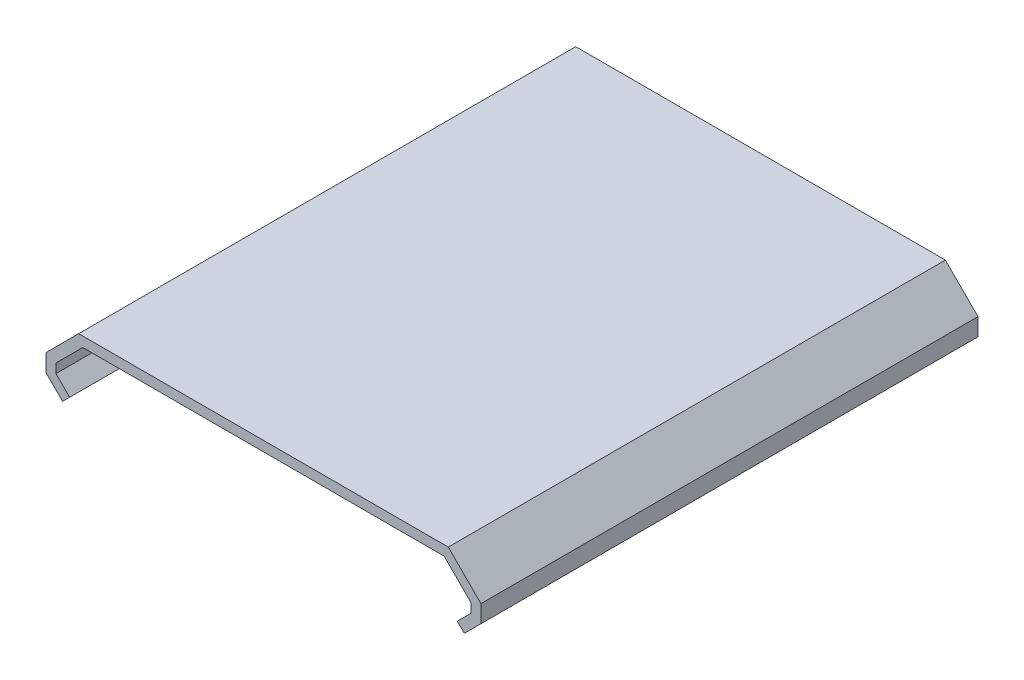
ISO-10303-21;
HEADER;
FILE_DESCRIPTION(('STEP AP214'),'2;1');
FILE_NAME('part.step','',(''),(''),'','','');
FILE_SCHEMA(('AUTOMOTIVE_DESIGN { 1 0 10303 214 1 1 1 1 }'));
ENDSEC;
DATA;
#1=APPLICATION_CONTEXT('core data for automotive mechanical design processes');
#2=APPLICATION_PROTOCOL_DEFINITION('international standard','automotive_design',2000,#1);
#3=PRODUCT_CONTEXT('',#1,'mechanical');
#4=PRODUCT('Part','Part','',(#3));
#5=PRODUCT_RELATED_PRODUCT_CATEGORY('part','',(#4));
#6=PRODUCT_DEFINITION_FORMATION('','',#4);
#7=PRODUCT_DEFINITION_CONTEXT('part definition',#1,'design');
#8=PRODUCT_DEFINITION('design','',#6,#7);
#9=PRODUCT_DEFINITION_SHAPE('','',#8);
#10=(LENGTH_UNIT() NAMED_UNIT(*) SI_UNIT(.MILLI.,.METRE.));
#11=(NAMED_UNIT(*) PLANE_ANGLE_UNIT() SI_UNIT($,.RADIAN.));
#12=(NAMED_UNIT(*) SI_UNIT($,.STERADIAN.) SOLID_ANGLE_UNIT());
#13=UNCERTAINTY_MEASURE_WITH_UNIT(LENGTH_MEASURE(1.E-05),#10,'distance_accuracy_value','');
#14=(GEOMETRIC_REPRESENTATION_CONTEXT(3) GLOBAL_UNCERTAINTY_ASSIGNED_CONTEXT((#13)) GLOBAL_UNIT_ASSIGNED_CONTEXT((#10,
#11,#12)) REPRESENTATION_CONTEXT('',''));
#15=CARTESIAN_POINT('',(0.,0.,0.));
#16=DIRECTION('',(0.,0.,1.));
#17=DIRECTION('',(1.,0.,0.));
#18=AXIS2_PLACEMENT_3D('',#15,#16,#17);
#19=CARTESIAN_POINT('',(83.5,37.5,-200.));
#20=DIRECTION('',(-0.707106781186549,0.707106781186546,0.));
#21=DIRECTION('',(-0.707106781186546,-0.707106781186549,0.));
#22=AXIS2_PLACEMENT_3D('',#19,#20,#21);
#23=PLANE('',#22);
#24=DIRECTION('',(-0.707106781186546,-0.707106781186549,0.));
#25=VECTOR('',#24,1.);
#26=CARTESIAN_POINT('',(83.5,37.5,0.));
#27=LINE('',#26,#25);
#28=CARTESIAN_POINT('',(83.5,37.5,0.));
#29=VERTEX_POINT('',#28);
#30=CARTESIAN_POINT('',(78.,32.,0.));
#31=VERTEX_POINT('',#30);
#32=EDGE_CURVE('E196',#29,#31,#27,.T.);
#33=ORIENTED_EDGE('',*,*,#32,.F.);
#34=DIRECTION('',(0.,0.,1.));
#35=VECTOR('',#34,1.);
#36=CARTESIAN_POINT('',(83.5,37.5,-200.));
#37=LINE('',#36,#35);
#38=CARTESIAN_POINT('',(83.5,37.5,-200.));
#39=VERTEX_POINT('',#38);
#40=EDGE_CURVE('E11',#39,#29,#37,.T.);
#41=ORIENTED_EDGE('',*,*,#40,.F.);
#42=DIRECTION('',(-0.707106781186546,-0.707106781186549,0.));
#43=VECTOR('',#42,1.);
#44=CARTESIAN_POINT('',(83.5,37.5,-200.));
#45=LINE('',#44,#43);
#46=CARTESIAN_POINT('',(78.,32.,-200.));
#47=VERTEX_POINT('',#46);
#48=EDGE_CURVE('E198',#39,#47,#45,.T.);
#49=ORIENTED_EDGE('',*,*,#48,.T.);
#50=DIRECTION('',(0.,0.,1.));
#51=VECTOR('',#50,1.);
#52=CARTESIAN_POINT('',(78.,32.,-200.));
#53=LINE('',#52,#51);
#54=EDGE_CURVE('E44',#47,#31,#53,.T.);
#55=ORIENTED_EDGE('',*,*,#54,.T.);
#56=EDGE_LOOP('',(#33,#41,#49,#55));
#57=FACE_BOUND('',#56,.T.);
#58=ADVANCED_FACE('F41',(#57),#23,.T.);
#59=CARTESIAN_POINT('',(83.5,41.2071067811866,-200.));
#60=DIRECTION('',(-1.,0.,0.));
#61=DIRECTION('',(0.,0.,1.));
#62=AXIS2_PLACEMENT_3D('',#59,#60,#61);
#63=PLANE('',#62);
#64=DIRECTION('',(0.,-1.,0.));
#65=VECTOR('',#64,1.);
#66=CARTESIAN_POINT('',(83.5,41.2071067811866,0.));
#67=LINE('',#66,#65);
#68=CARTESIAN_POINT('',(83.5,41.2071067811866,0.));
#69=VERTEX_POINT('',#68);
#70=EDGE_CURVE('E202',#69,#29,#67,.T.);
#71=ORIENTED_EDGE('',*,*,#70,.F.);
#72=DIRECTION('',(0.,0.,1.));
#73=VECTOR('',#72,1.);
#74=CARTESIAN_POINT('',(83.5,41.2071067811866,-200.));
#75=LINE('',#74,#73);
#76=CARTESIAN_POINT('',(83.5,41.2071067811866,-200.));
#77=VERTEX_POINT('',#76);
#78=EDGE_CURVE('E49',#77,#69,#75,.T.);
#79=ORIENTED_EDGE('',*,*,#78,.F.);
#80=DIRECTION('',(0.,-1.,0.));
#81=VECTOR('',#80,1.);
#82=CARTESIAN_POINT('',(83.5,41.2071067811866,-200.));
#83=LINE('',#82,#81);
#84=EDGE_CURVE('E236',#77,#39,#83,.T.);
#85=ORIENTED_EDGE('',*,*,#84,.T.);
#86=ORIENTED_EDGE('',*,*,#40,.T.);
#87=EDGE_LOOP('',(#71,#79,#85,#86));
#88=FACE_BOUND('',#87,.T.);
#89=ADVANCED_FACE('F326',(#88),#63,.T.);
#90=CARTESIAN_POINT('',(72.7071067811866,52.,-200.));
#91=DIRECTION('',(-0.707106781186547,-0.707106781186547,0.));
#92=DIRECTION('',(0.707106781186548,-0.707106781186548,0.));
#93=AXIS2_PLACEMENT_3D('',#90,#91,#92);
#94=PLANE('',#93);
#95=DIRECTION('',(0.707106781186547,-0.707106781186547,0.));
#96=VECTOR('',#95,1.);
#97=CARTESIAN_POINT('',(72.7071067811866,52.,0.));
#98=LINE('',#97,#96);
#99=CARTESIAN_POINT('',(72.7071067811866,52.,0.));
#100=VERTEX_POINT('',#99);
#101=EDGE_CURVE('E272',#100,#69,#98,.T.);
#102=ORIENTED_EDGE('',*,*,#101,.F.);
#103=DIRECTION('',(0.,0.,1.));
#104=VECTOR('',#103,1.);
#105=CARTESIAN_POINT('',(72.7071067811866,52.,-200.));
#106=LINE('',#105,#104);
#107=CARTESIAN_POINT('',(72.7071067811866,52.,-200.));
#108=VERTEX_POINT('',#107);
#109=EDGE_CURVE('E278',#108,#100,#106,.T.);
#110=ORIENTED_EDGE('',*,*,#109,.F.);
#111=DIRECTION('',(0.707106781186547,-0.707106781186547,0.));
#112=VECTOR('',#111,1.);
#113=CARTESIAN_POINT('',(72.7071067811866,52.,-200.));
#114=LINE('',#113,#112);
#115=EDGE_CURVE('E233',#108,#77,#114,.T.);
#116=ORIENTED_EDGE('',*,*,#115,.T.);
#117=ORIENTED_EDGE('',*,*,#78,.T.);
#118=EDGE_LOOP('',(#102,#110,#116,#117));
#119=FACE_BOUND('',#118,.T.);
#120=ADVANCED_FACE('F383',(#119),#94,.T.);
#121=CARTESIAN_POINT('',(0.,52.,-200.));
#122=DIRECTION('',(0.,-1.,0.));
#123=DIRECTION('',(1.,0.,0.));
#124=AXIS2_PLACEMENT_3D('',#121,#122,#123);
#125=PLANE('',#124);
#126=DIRECTION('',(0.,0.,-1.));
#127=VECTOR('',#126,1.);
#128=CARTESIAN_POINT('',(8.41421356228056,52.,-182.));
#129=LINE('',#128,#127);
#130=CARTESIAN_POINT('',(8.41421356228056,52.,-182.));
#131=VERTEX_POINT('',#130);
#132=CARTESIAN_POINT('',(8.41421356228056,52.,-200.));
#133=VERTEX_POINT('',#132);
#134=EDGE_CURVE('E188',#131,#133,#129,.T.);
#135=ORIENTED_EDGE('',*,*,#134,.T.);
#136=DIRECTION('',(1.,0.,0.));
#137=VECTOR('',#136,1.);
#138=CARTESIAN_POINT('',(0.,52.,-200.));
#139=LINE('',#138,#137);
#140=EDGE_CURVE('E230',#133,#108,#139,.T.);
#141=ORIENTED_EDGE('',*,*,#140,.T.);
#142=ORIENTED_EDGE('',*,*,#109,.T.);
#143=DIRECTION('',(1.,0.,0.));
#144=VECTOR('',#143,1.);
#145=CARTESIAN_POINT('',(0.,52.,0.));
#146=LINE('',#145,#144);
#147=CARTESIAN_POINT('',(-72.7071067811866,52.,0.));
#148=VERTEX_POINT('',#147);
#149=EDGE_CURVE('E269',#148,#100,#146,.T.);
#150=ORIENTED_EDGE('',*,*,#149,.F.);
#151=DIRECTION('',(0.,0.,1.));
#152=VECTOR('',#151,1.);
#153=CARTESIAN_POINT('',(-72.7071067811866,52.,-200.));
#154=LINE('',#153,#152);
#155=CARTESIAN_POINT('',(-72.7071067811866,52.,-200.));
#156=VERTEX_POINT('',#155);
#157=EDGE_CURVE('E280',#156,#148,#154,.T.);
#158=ORIENTED_EDGE('',*,*,#157,.F.);
#159=CARTESIAN_POINT('',(-2.99999999999978,52.,-200.));
#160=VERTEX_POINT('',#159);
#161=EDGE_CURVE('E231',#156,#160,#139,.T.);
#162=ORIENTED_EDGE('',*,*,#161,.T.);
#163=DIRECTION('',(0.,0.,-1.));
#164=VECTOR('',#163,1.);
#165=CARTESIAN_POINT('',(-2.99999999999978,52.,-182.));
#166=LINE('',#165,#164);
#167=CARTESIAN_POINT('',(-2.99999999999978,52.,-182.));
#168=VERTEX_POINT('',#167);
#169=EDGE_CURVE('E57',#168,#160,#166,.T.);
#170=ORIENTED_EDGE('',*,*,#169,.F.);
#171=DIRECTION('',(1.,0.,0.));
#172=VECTOR('',#171,1.);
#173=CARTESIAN_POINT('',(8.41421356228056,52.,-182.));
#174=LINE('',#173,#172);
#175=EDGE_CURVE('E62',#168,#131,#174,.T.);
#176=ORIENTED_EDGE('',*,*,#175,.T.);
#177=EDGE_LOOP('',(#135,#141,#142,#150,#158,#162,#170,#176));
#178=FACE_BOUND('',#177,.T.);
#179=ADVANCED_FACE('F380',(#178),#125,.T.);
#180=CARTESIAN_POINT('',(-72.7071067811866,52.,-200.));
#181=DIRECTION('',(0.707106781186547,-0.707106781186547,0.));
#182=DIRECTION('',(0.707106781186548,0.707106781186548,0.));
#183=AXIS2_PLACEMENT_3D('',#180,#181,#182);
#184=PLANE('',#183);
#185=DIRECTION('',(0.707106781186547,0.707106781186547,0.));
#186=VECTOR('',#185,1.);
#187=CARTESIAN_POINT('',(-72.7071067811866,52.,0.));
#188=LINE('',#187,#186);
#189=CARTESIAN_POINT('',(-83.5,41.2071067811866,0.));
#190=VERTEX_POINT('',#189);
#191=EDGE_CURVE('E266',#190,#148,#188,.T.);
#192=ORIENTED_EDGE('',*,*,#191,.F.);
#193=DIRECTION('',(0.,0.,1.));
#194=VECTOR('',#193,1.);
#195=CARTESIAN_POINT('',(-83.5,41.2071067811866,-200.));
#196=LINE('',#195,#194);
#197=CARTESIAN_POINT('',(-83.5,41.2071067811866,-200.));
#198=VERTEX_POINT('',#197);
#199=EDGE_CURVE('E283',#198,#190,#196,.T.);
#200=ORIENTED_EDGE('',*,*,#199,.F.);
#201=DIRECTION('',(0.707106781186547,0.707106781186547,0.));
#202=VECTOR('',#201,1.);
#203=CARTESIAN_POINT('',(-72.7071067811866,52.,-200.));
#204=LINE('',#203,#202);
#205=EDGE_CURVE('E227',#198,#156,#204,.T.);
#206=ORIENTED_EDGE('',*,*,#205,.T.);
#207=ORIENTED_EDGE('',*,*,#157,.T.);
#208=EDGE_LOOP('',(#192,#200,#206,#207));
#209=FACE_BOUND('',#208,.T.);
#210=ADVANCED_FACE('F377',(#209),#184,.T.);
#211=CARTESIAN_POINT('',(-83.5,41.2071067811866,-200.));
#212=DIRECTION('',(1.,0.,0.));
#213=DIRECTION('',(0.,0.,-1.));
#214=AXIS2_PLACEMENT_3D('',#211,#212,#213);
#215=PLANE('',#214);
#216=DIRECTION('',(0.,1.,0.));
#217=VECTOR('',#216,1.);
#218=CARTESIAN_POINT('',(-83.5,41.2071067811866,0.));
#219=LINE('',#218,#217);
#220=CARTESIAN_POINT('',(-83.5,37.5,0.));
#221=VERTEX_POINT('',#220);
#222=EDGE_CURVE('E263',#221,#190,#219,.T.);
#223=ORIENTED_EDGE('',*,*,#222,.F.);
#224=DIRECTION('',(0.,0.,1.));
#225=VECTOR('',#224,1.);
#226=CARTESIAN_POINT('',(-83.5,37.5,-200.));
#227=LINE('',#226,#225);
#228=CARTESIAN_POINT('',(-83.5,37.5,-200.));
#229=VERTEX_POINT('',#228);
#230=EDGE_CURVE('E285',#229,#221,#227,.T.);
#231=ORIENTED_EDGE('',*,*,#230,.F.);
#232=DIRECTION('',(0.,1.,0.));
#233=VECTOR('',#232,1.);
#234=CARTESIAN_POINT('',(-83.5,41.2071067811866,-200.));
#235=LINE('',#234,#233);
#236=EDGE_CURVE('E224',#229,#198,#235,.T.);
#237=ORIENTED_EDGE('',*,*,#236,.T.);
#238=ORIENTED_EDGE('',*,*,#199,.T.);
#239=EDGE_LOOP('',(#223,#231,#237,#238));
#240=FACE_BOUND('',#239,.T.);
#241=ADVANCED_FACE('F374',(#240),#215,.T.);
#242=CARTESIAN_POINT('',(-83.5,37.5,-200.));
#243=DIRECTION('',(0.707106781186549,0.707106781186546,0.));
#244=DIRECTION('',(-0.707106781186546,0.707106781186549,0.));
#245=AXIS2_PLACEMENT_3D('',#242,#243,#244);
#246=PLANE('',#245);
#247=DIRECTION('',(-0.707106781186546,0.707106781186549,0.));
#248=VECTOR('',#247,1.);
#249=CARTESIAN_POINT('',(-83.5,37.5,0.));
#250=LINE('',#249,#248);
#251=CARTESIAN_POINT('',(-78.,32.,0.));
#252=VERTEX_POINT('',#251);
#253=EDGE_CURVE('E260',#252,#221,#250,.T.);
#254=ORIENTED_EDGE('',*,*,#253,.F.);
#255=DIRECTION('',(0.,0.,1.));
#256=VECTOR('',#255,1.);
#257=CARTESIAN_POINT('',(-78.,32.,-200.));
#258=LINE('',#257,#256);
#259=CARTESIAN_POINT('',(-78.,32.,-200.));
#260=VERTEX_POINT('',#259);
#261=EDGE_CURVE('E287',#260,#252,#258,.T.);
#262=ORIENTED_EDGE('',*,*,#261,.F.);
#263=DIRECTION('',(-0.707106781186546,0.707106781186549,0.));
#264=VECTOR('',#263,1.);
#265=CARTESIAN_POINT('',(-83.5,37.5,-200.));
#266=LINE('',#265,#264);
#267=EDGE_CURVE('E221',#260,#229,#266,.T.);
#268=ORIENTED_EDGE('',*,*,#267,.T.);
#269=ORIENTED_EDGE('',*,*,#230,.T.);
#270=EDGE_LOOP('',(#254,#262,#268,#269));
#271=FACE_BOUND('',#270,.T.);
#272=ADVANCED_FACE('F368',(#271),#246,.T.);
#273=CARTESIAN_POINT('',(-78.,32.,-200.));
#274=DIRECTION('',(-0.707106781186547,0.707106781186548,0.));
#275=DIRECTION('',(-0.707106781186548,-0.707106781186547,0.));
#276=AXIS2_PLACEMENT_3D('',#273,#274,#275);
#277=PLANE('',#276);
#278=DIRECTION('',(-0.707106781186548,-0.707106781186547,0.));
#279=VECTOR('',#278,1.);
#280=CARTESIAN_POINT('',(-78.,32.,0.));
#281=LINE('',#280,#279);
#282=CARTESIAN_POINT('',(-80.8284271247462,29.1715728752538,0.));
#283=VERTEX_POINT('',#282);
#284=EDGE_CURVE('E258',#252,#283,#281,.T.);
#285=ORIENTED_EDGE('',*,*,#284,.T.);
#286=DIRECTION('',(0.,0.,1.));
#287=VECTOR('',#286,1.);
#288=CARTESIAN_POINT('',(-80.8284271247462,29.1715728752538,-200.));
#289=LINE('',#288,#287);
#290=CARTESIAN_POINT('',(-80.8284271247462,29.1715728752538,-200.));
#291=VERTEX_POINT('',#290);
#292=EDGE_CURVE('E289',#291,#283,#289,.T.);
#293=ORIENTED_EDGE('',*,*,#292,.F.);
#294=DIRECTION('',(-0.707106781186548,-0.707106781186547,0.));
#295=VECTOR('',#294,1.);
#296=CARTESIAN_POINT('',(-78.,32.,-200.));
#297=LINE('',#296,#295);
#298=EDGE_CURVE('E219',#260,#291,#297,.T.);
#299=ORIENTED_EDGE('',*,*,#298,.F.);
#300=ORIENTED_EDGE('',*,*,#261,.T.);
#301=EDGE_LOOP('',(#285,#293,#299,#300));
#302=FACE_BOUND('',#301,.T.);
#303=ADVANCED_FACE('F441',(#302),#277,.F.);
#304=CARTESIAN_POINT('',(-86.3284271247462,34.6715728752538,-200.));
#305=DIRECTION('',(0.707106781186549,0.707106781186546,0.));
#306=DIRECTION('',(-0.707106781186546,0.707106781186549,0.));
#307=AXIS2_PLACEMENT_3D('',#304,#305,#306);
#308=PLANE('',#307);
#309=DIRECTION('',(-0.707106781186546,0.707106781186549,0.));
#310=VECTOR('',#309,1.);
#311=CARTESIAN_POINT('',(-86.3284271247462,34.6715728752538,0.));
#312=LINE('',#311,#310);
#313=CARTESIAN_POINT('',(-87.5,35.8431457505076,0.));
#314=VERTEX_POINT('',#313);
#315=EDGE_CURVE('E256',#283,#314,#312,.T.);
#316=ORIENTED_EDGE('',*,*,#315,.T.);
#317=DIRECTION('',(0.,0.,1.));
#318=VECTOR('',#317,1.);
#319=CARTESIAN_POINT('',(-87.5,35.8431457505076,-200.));
#320=LINE('',#319,#318);
#321=CARTESIAN_POINT('',(-87.5,35.8431457505076,-200.));
#322=VERTEX_POINT('',#321);
#323=EDGE_CURVE('E292',#322,#314,#320,.T.);
#324=ORIENTED_EDGE('',*,*,#323,.F.);
#325=DIRECTION('',(-0.707106781186546,0.707106781186549,0.));
#326=VECTOR('',#325,1.);
#327=CARTESIAN_POINT('',(-86.3284271247462,34.6715728752538,-200.));
#328=LINE('',#327,#326);
#329=EDGE_CURVE('E217',#291,#322,#328,.T.);
#330=ORIENTED_EDGE('',*,*,#329,.F.);
#331=ORIENTED_EDGE('',*,*,#292,.T.);
#332=EDGE_LOOP('',(#316,#324,#330,#331));
#333=FACE_BOUND('',#332,.T.);
#334=ADVANCED_FACE('F362',(#333),#308,.F.);
#335=CARTESIAN_POINT('',(-87.5,41.2071067811866,-200.));
#336=DIRECTION('',(1.,0.,0.));
#337=DIRECTION('',(0.,0.,-1.));
#338=AXIS2_PLACEMENT_3D('',#335,#336,#337);
#339=PLANE('',#338);
#340=DIRECTION('',(0.,1.,0.));
#341=VECTOR('',#340,1.);
#342=CARTESIAN_POINT('',(-87.5,41.2071067811866,0.));
#343=LINE('',#342,#341);
#344=CARTESIAN_POINT('',(-87.5,42.863961030679,0.));
#345=VERTEX_POINT('',#344);
#346=EDGE_CURVE('E254',#314,#345,#343,.T.);
#347=ORIENTED_EDGE('',*,*,#346,.T.);
#348=DIRECTION('',(0.,0.,1.));
#349=VECTOR('',#348,1.);
#350=CARTESIAN_POINT('',(-87.5,42.863961030679,-200.));
#351=LINE('',#350,#349);
#352=CARTESIAN_POINT('',(-87.5,42.863961030679,-200.));
#353=VERTEX_POINT('',#352);
#354=EDGE_CURVE('E295',#353,#345,#351,.T.);
#355=ORIENTED_EDGE('',*,*,#354,.F.);
#356=DIRECTION('',(0.,1.,0.));
#357=VECTOR('',#356,1.);
#358=CARTESIAN_POINT('',(-87.5,41.2071067811866,-200.));
#359=LINE('',#358,#357);
#360=EDGE_CURVE('E215',#322,#353,#359,.T.);
#361=ORIENTED_EDGE('',*,*,#360,.F.);
#362=ORIENTED_EDGE('',*,*,#323,.T.);
#363=EDGE_LOOP('',(#347,#355,#361,#362));
#364=FACE_BOUND('',#363,.T.);
#365=ADVANCED_FACE('F358',(#364),#339,.F.);
#366=CARTESIAN_POINT('',(-75.5355339059328,54.8284271247462,-200.));
#367=DIRECTION('',(0.707106781186548,-0.707106781186548,0.));
#368=DIRECTION('',(0.707106781186548,0.707106781186548,0.));
#369=AXIS2_PLACEMENT_3D('',#366,#367,#368);
#370=PLANE('',#369);
#371=DIRECTION('',(0.707106781186548,0.707106781186548,0.));
#372=VECTOR('',#371,1.);
#373=CARTESIAN_POINT('',(-75.5355339059328,54.8284271247462,0.));
#374=LINE('',#373,#372);
#375=CARTESIAN_POINT('',(-74.363961030679,56.,0.));
#376=VERTEX_POINT('',#375);
#377=EDGE_CURVE('E252',#345,#376,#374,.T.);
#378=ORIENTED_EDGE('',*,*,#377,.T.);
#379=DIRECTION('',(0.,0.,1.));
#380=VECTOR('',#379,1.);
#381=CARTESIAN_POINT('',(-74.363961030679,56.,-200.));
#382=LINE('',#381,#380);
#383=CARTESIAN_POINT('',(-74.363961030679,56.,-200.));
#384=VERTEX_POINT('',#383);
#385=EDGE_CURVE('E298',#384,#376,#382,.T.);
#386=ORIENTED_EDGE('',*,*,#385,.F.);
#387=DIRECTION('',(0.707106781186548,0.707106781186548,0.));
#388=VECTOR('',#387,1.);
#389=CARTESIAN_POINT('',(-75.5355339059328,54.8284271247462,-200.));
#390=LINE('',#389,#388);
#391=EDGE_CURVE('E212',#353,#384,#390,.T.);
#392=ORIENTED_EDGE('',*,*,#391,.F.);
#393=ORIENTED_EDGE('',*,*,#354,.T.);
#394=EDGE_LOOP('',(#378,#386,#392,#393));
#395=FACE_BOUND('',#394,.T.);
#396=ADVANCED_FACE('F353',(#395),#370,.F.);
#397=CARTESIAN_POINT('',(0.,56.,-200.));
#398=DIRECTION('',(0.,-1.,0.));
#399=DIRECTION('',(1.,0.,0.));
#400=AXIS2_PLACEMENT_3D('',#397,#398,#399);
#401=PLANE('',#400);
#402=DIRECTION('',(1.,0.,0.));
#403=VECTOR('',#402,1.);
#404=CARTESIAN_POINT('',(0.,56.,0.));
#405=LINE('',#404,#403);
#406=CARTESIAN_POINT('',(74.363961030679,56.,0.));
#407=VERTEX_POINT('',#406);
#408=EDGE_CURVE('E250',#376,#407,#405,.T.);
#409=ORIENTED_EDGE('',*,*,#408,.T.);
#410=DIRECTION('',(0.,0.,1.));
#411=VECTOR('',#410,1.);
#412=CARTESIAN_POINT('',(74.363961030679,56.,-200.));
#413=LINE('',#412,#411);
#414=CARTESIAN_POINT('',(74.363961030679,56.,-200.));
#415=VERTEX_POINT('',#414);
#416=EDGE_CURVE('E301',#415,#407,#413,.T.);
#417=ORIENTED_EDGE('',*,*,#416,.F.);
#418=DIRECTION('',(1.,0.,0.));
#419=VECTOR('',#418,1.);
#420=CARTESIAN_POINT('',(0.,56.,-200.));
#421=LINE('',#420,#419);
#422=EDGE_CURVE('E210',#384,#415,#421,.T.);
#423=ORIENTED_EDGE('',*,*,#422,.F.);
#424=ORIENTED_EDGE('',*,*,#385,.T.);
#425=EDGE_LOOP('',(#409,#417,#423,#424));
#426=FACE_BOUND('',#425,.T.);
#427=ADVANCED_FACE('F347',(#426),#401,.F.);
#428=CARTESIAN_POINT('',(75.5355339059328,54.8284271247462,-200.));
#429=DIRECTION('',(-0.707106781186548,-0.707106781186548,0.));
#430=DIRECTION('',(0.707106781186548,-0.707106781186548,0.));
#431=AXIS2_PLACEMENT_3D('',#428,#429,#430);
#432=PLANE('',#431);
#433=DIRECTION('',(0.707106781186548,-0.707106781186548,0.));
#434=VECTOR('',#433,1.);
#435=CARTESIAN_POINT('',(75.5355339059328,54.8284271247462,0.));
#436=LINE('',#435,#434);
#437=CARTESIAN_POINT('',(87.5,42.863961030679,0.));
#438=VERTEX_POINT('',#437);
#439=EDGE_CURVE('E248',#407,#438,#436,.T.);
#440=ORIENTED_EDGE('',*,*,#439,.T.);
#441=DIRECTION('',(0.,0.,1.));
#442=VECTOR('',#441,1.);
#443=CARTESIAN_POINT('',(87.5,42.863961030679,-200.));
#444=LINE('',#443,#442);
#445=CARTESIAN_POINT('',(87.5,42.863961030679,-200.));
#446=VERTEX_POINT('',#445);
#447=EDGE_CURVE('E304',#446,#438,#444,.T.);
#448=ORIENTED_EDGE('',*,*,#447,.F.);
#449=DIRECTION('',(0.707106781186548,-0.707106781186548,0.));
#450=VECTOR('',#449,1.);
#451=CARTESIAN_POINT('',(75.5355339059328,54.8284271247462,-200.));
#452=LINE('',#451,#450);
#453=EDGE_CURVE('E208',#415,#446,#452,.T.);
#454=ORIENTED_EDGE('',*,*,#453,.F.);
#455=ORIENTED_EDGE('',*,*,#416,.T.);
#456=EDGE_LOOP('',(#440,#448,#454,#455));
#457=FACE_BOUND('',#456,.T.);
#458=ADVANCED_FACE('F344',(#457),#432,.F.);
#459=CARTESIAN_POINT('',(87.5,41.2071067811866,-200.));
#460=DIRECTION('',(-1.,0.,0.));
#461=DIRECTION('',(0.,0.,1.));
#462=AXIS2_PLACEMENT_3D('',#459,#460,#461);
#463=PLANE('',#462);
#464=DIRECTION('',(0.,1.,0.));
#465=VECTOR('',#464,1.);
#466=CARTESIAN_POINT('',(87.5,41.2071067811866,0.));
#467=LINE('',#466,#465);
#468=CARTESIAN_POINT('',(87.5,35.8431457505076,0.));
#469=VERTEX_POINT('',#468);
#470=EDGE_CURVE('E246',#438,#469,#467,.F.);
#471=ORIENTED_EDGE('',*,*,#470,.T.);
#472=DIRECTION('',(0.,0.,1.));
#473=VECTOR('',#472,1.);
#474=CARTESIAN_POINT('',(87.5,35.8431457505076,-200.));
#475=LINE('',#474,#473);
#476=CARTESIAN_POINT('',(87.5,35.8431457505076,-200.));
#477=VERTEX_POINT('',#476);
#478=EDGE_CURVE('E307',#477,#469,#475,.T.);
#479=ORIENTED_EDGE('',*,*,#478,.F.);
#480=DIRECTION('',(0.,1.,0.));
#481=VECTOR('',#480,1.);
#482=CARTESIAN_POINT('',(87.5,41.2071067811866,-200.));
#483=LINE('',#482,#481);
#484=EDGE_CURVE('E206',#446,#477,#483,.F.);
#485=ORIENTED_EDGE('',*,*,#484,.F.);
#486=ORIENTED_EDGE('',*,*,#447,.T.);
#487=EDGE_LOOP('',(#471,#479,#485,#486));
#488=FACE_BOUND('',#487,.T.);
#489=ADVANCED_FACE('F340',(#488),#463,.F.);
#490=CARTESIAN_POINT('',(86.3284271247462,34.6715728752538,-200.));
#491=DIRECTION('',(-0.707106781186549,0.707106781186546,0.));
#492=DIRECTION('',(-0.707106781186546,-0.707106781186549,0.));
#493=AXIS2_PLACEMENT_3D('',#490,#491,#492);
#494=PLANE('',#493);
#495=DIRECTION('',(-0.707106781186546,-0.707106781186549,0.));
#496=VECTOR('',#495,1.);
#497=CARTESIAN_POINT('',(86.3284271247462,34.6715728752538,0.));
#498=LINE('',#497,#496);
#499=CARTESIAN_POINT('',(80.8284271247462,29.1715728752538,0.));
#500=VERTEX_POINT('',#499);
#501=EDGE_CURVE('E244',#469,#500,#498,.T.);
#502=ORIENTED_EDGE('',*,*,#501,.T.);
#503=DIRECTION('',(0.,0.,1.));
#504=VECTOR('',#503,1.);
#505=CARTESIAN_POINT('',(80.8284271247462,29.1715728752538,-200.));
#506=LINE('',#505,#504);
#507=CARTESIAN_POINT('',(80.8284271247462,29.1715728752538,-200.));
#508=VERTEX_POINT('',#507);
#509=EDGE_CURVE('E309',#508,#500,#506,.T.);
#510=ORIENTED_EDGE('',*,*,#509,.F.);
#511=DIRECTION('',(-0.707106781186546,-0.707106781186549,0.));
#512=VECTOR('',#511,1.);
#513=CARTESIAN_POINT('',(86.3284271247462,34.6715728752538,-200.));
#514=LINE('',#513,#512);
#515=EDGE_CURVE('E204',#477,#508,#514,.T.);
#516=ORIENTED_EDGE('',*,*,#515,.F.);
#517=ORIENTED_EDGE('',*,*,#478,.T.);
#518=EDGE_LOOP('',(#502,#510,#516,#517));
#519=FACE_BOUND('',#518,.T.);
#520=ADVANCED_FACE('F335',(#519),#494,.F.);
#521=CARTESIAN_POINT('',(80.8284271247462,29.1715728752538,-200.));
#522=DIRECTION('',(0.707106781186547,0.707106781186548,0.));
#523=DIRECTION('',(-0.707106781186548,0.707106781186547,0.));
#524=AXIS2_PLACEMENT_3D('',#521,#522,#523);
#525=PLANE('',#524);
#526=DIRECTION('',(-0.707106781186548,0.707106781186547,0.));
#527=VECTOR('',#526,1.);
#528=CARTESIAN_POINT('',(80.8284271247462,29.1715728752538,0.));
#529=LINE('',#528,#527);
#530=EDGE_CURVE('E241',#500,#31,#529,.T.);
#531=ORIENTED_EDGE('',*,*,#530,.T.);
#532=ORIENTED_EDGE('',*,*,#54,.F.);
#533=DIRECTION('',(-0.707106781186548,0.707106781186547,0.));
#534=VECTOR('',#533,1.);
#535=CARTESIAN_POINT('',(80.8284271247462,29.1715728752538,-200.));
#536=LINE('',#535,#534);
#537=EDGE_CURVE('E201',#508,#47,#536,.T.);
#538=ORIENTED_EDGE('',*,*,#537,.F.);
#539=ORIENTED_EDGE('',*,*,#509,.T.);
#540=EDGE_LOOP('',(#531,#532,#538,#539));
#541=FACE_BOUND('',#540,.T.);
#542=ADVANCED_FACE('F319',(#541),#525,.F.);
#543=CARTESIAN_POINT('',(0.,0.,-200.));
#544=DIRECTION('',(0.,0.,-1.));
#545=DIRECTION('',(-1.,0.,0.));
#546=AXIS2_PLACEMENT_3D('',#543,#544,#545);
#547=PLANE('',#546);
#548=ORIENTED_EDGE('',*,*,#48,.F.);
#549=ORIENTED_EDGE('',*,*,#84,.F.);
#550=ORIENTED_EDGE('',*,*,#115,.F.);
#551=ORIENTED_EDGE('',*,*,#140,.F.);
#552=DIRECTION('',(-0.707106781186548,-0.707106781186547,0.));
#553=VECTOR('',#552,1.);
#554=CARTESIAN_POINT('',(-2.99999999999978,40.5857864377197,-200.));
#555=LINE('',#554,#553);
#556=CARTESIAN_POINT('',(-2.99999999999978,40.5857864377197,-200.));
#557=VERTEX_POINT('',#556);
#558=EDGE_CURVE('E190',#133,#557,#555,.T.);
#559=ORIENTED_EDGE('',*,*,#558,.T.);
#560=DIRECTION('',(0.,1.,0.));
#561=VECTOR('',#560,1.);
#562=CARTESIAN_POINT('',(-2.99999999999978,52.,-200.));
#563=LINE('',#562,#561);
#564=EDGE_CURVE('E176',#557,#160,#563,.T.);
#565=ORIENTED_EDGE('',*,*,#564,.T.);
#566=ORIENTED_EDGE('',*,*,#161,.F.);
#567=ORIENTED_EDGE('',*,*,#205,.F.);
#568=ORIENTED_EDGE('',*,*,#236,.F.);
#569=ORIENTED_EDGE('',*,*,#267,.F.);
#570=ORIENTED_EDGE('',*,*,#298,.T.);
#571=ORIENTED_EDGE('',*,*,#329,.T.);
#572=ORIENTED_EDGE('',*,*,#360,.T.);
#573=ORIENTED_EDGE('',*,*,#391,.T.);
#574=ORIENTED_EDGE('',*,*,#422,.T.);
#575=ORIENTED_EDGE('',*,*,#453,.T.);
#576=ORIENTED_EDGE('',*,*,#484,.T.);
#577=ORIENTED_EDGE('',*,*,#515,.T.);
#578=ORIENTED_EDGE('',*,*,#537,.T.);
#579=EDGE_LOOP('',(#548,#549,#550,#551,#559,#565,#566,#567,#568,#569,#570,#571,#572,#573,#574,
#575,#576,#577,#578));
#580=FACE_BOUND('',#579,.T.);
#581=ADVANCED_FACE('F329',(#580),#547,.T.);
#582=CARTESIAN_POINT('',(0.,0.,0.));
#583=DIRECTION('',(0.,0.,-1.));
#584=DIRECTION('',(-1.,0.,0.));
#585=AXIS2_PLACEMENT_3D('',#582,#583,#584);
#586=PLANE('',#585);
#587=ORIENTED_EDGE('',*,*,#32,.T.);
#588=ORIENTED_EDGE('',*,*,#530,.F.);
#589=ORIENTED_EDGE('',*,*,#501,.F.);
#590=ORIENTED_EDGE('',*,*,#470,.F.);
#591=ORIENTED_EDGE('',*,*,#439,.F.);
#592=ORIENTED_EDGE('',*,*,#408,.F.);
#593=ORIENTED_EDGE('',*,*,#377,.F.);
#594=ORIENTED_EDGE('',*,*,#346,.F.);
#595=ORIENTED_EDGE('',*,*,#315,.F.);
#596=ORIENTED_EDGE('',*,*,#284,.F.);
#597=ORIENTED_EDGE('',*,*,#253,.T.);
#598=ORIENTED_EDGE('',*,*,#222,.T.);
#599=ORIENTED_EDGE('',*,*,#191,.T.);
#600=ORIENTED_EDGE('',*,*,#149,.T.);
#601=ORIENTED_EDGE('',*,*,#101,.T.);
#602=ORIENTED_EDGE('',*,*,#70,.T.);
#603=EDGE_LOOP('',(#587,#588,#589,#590,#591,#592,#593,#594,#595,#596,#597,#598,#599,#600,#601,#602));
#604=FACE_BOUND('',#603,.T.);
#605=ADVANCED_FACE('F322',(#604),#586,.F.);
#606=CARTESIAN_POINT('',(-2.99999999999978,40.5857864377197,-182.));
#607=DIRECTION('',(0.707106781186547,-0.707106781186548,0.));
#608=DIRECTION('',(0.707106781186548,0.707106781186547,0.));
#609=AXIS2_PLACEMENT_3D('',#606,#607,#608);
#610=PLANE('',#609);
#611=ORIENTED_EDGE('',*,*,#558,.F.);
#612=ORIENTED_EDGE('',*,*,#134,.F.);
#613=DIRECTION('',(-0.707106781186548,-0.707106781186547,0.));
#614=VECTOR('',#613,1.);
#615=CARTESIAN_POINT('',(-2.99999999999978,40.5857864377197,-182.));
#616=LINE('',#615,#614);
#617=CARTESIAN_POINT('',(-2.99999999999978,40.5857864377197,-182.));
#618=VERTEX_POINT('',#617);
#619=EDGE_CURVE('E185',#131,#618,#616,.T.);
#620=ORIENTED_EDGE('',*,*,#619,.T.);
#621=DIRECTION('',(0.,0.,-1.));
#622=VECTOR('',#621,1.);
#623=CARTESIAN_POINT('',(-2.99999999999978,40.5857864377197,-182.));
#624=LINE('',#623,#622);
#625=EDGE_CURVE('E171',#618,#557,#624,.T.);
#626=ORIENTED_EDGE('',*,*,#625,.T.);
#627=EDGE_LOOP('',(#611,#612,#620,#626));
#628=FACE_BOUND('',#627,.T.);
#629=ADVANCED_FACE('F187',(#628),#610,.T.);
#630=CARTESIAN_POINT('',(-2.99999999999978,52.,-182.));
#631=DIRECTION('',(-1.,0.,0.));
#632=DIRECTION('',(0.,-1.,0.));
#633=AXIS2_PLACEMENT_3D('',#630,#631,#632);
#634=PLANE('',#633);
#635=ORIENTED_EDGE('',*,*,#564,.F.);
#636=ORIENTED_EDGE('',*,*,#625,.F.);
#637=DIRECTION('',(0.,1.,0.));
#638=VECTOR('',#637,1.);
#639=CARTESIAN_POINT('',(-2.99999999999978,52.,-182.));
#640=LINE('',#639,#638);
#641=EDGE_CURVE('E174',#618,#168,#640,.T.);
#642=ORIENTED_EDGE('',*,*,#641,.T.);
#643=ORIENTED_EDGE('',*,*,#169,.T.);
#644=EDGE_LOOP('',(#635,#636,#642,#643));
#645=FACE_BOUND('',#644,.T.);
#646=ADVANCED_FACE('F173',(#645),#634,.T.);
#647=CARTESIAN_POINT('',(0.,0.,-182.));
#648=DIRECTION('',(0.,0.,1.));
#649=DIRECTION('',(1.,0.,0.));
#650=AXIS2_PLACEMENT_3D('',#647,#648,#649);
#651=PLANE('',#650);
#652=ORIENTED_EDGE('',*,*,#619,.F.);
#653=ORIENTED_EDGE('',*,*,#175,.F.);
#654=ORIENTED_EDGE('',*,*,#641,.F.);
#655=EDGE_LOOP('',(#652,#653,#654));
#656=FACE_BOUND('',#655,.T.);
#657=ADVANCED_FACE('F184',(#656),#651,.T.);
#658=CLOSED_SHELL('',(#58,#89,#120,#179,#210,#241,#272,#303,#334,#365,#396,#427,#458,#489,#520,
#542,#581,#605,#629,#646,#657));
#659=MANIFOLD_SOLID_BREP('B2',#658);
#660=ADVANCED_BREP_SHAPE_REPRESENTATION('',(#18,#659),#14);
#661=SHAPE_DEFINITION_REPRESENTATION(#9,#660);
ENDSEC;
END-ISO-10303-21;
